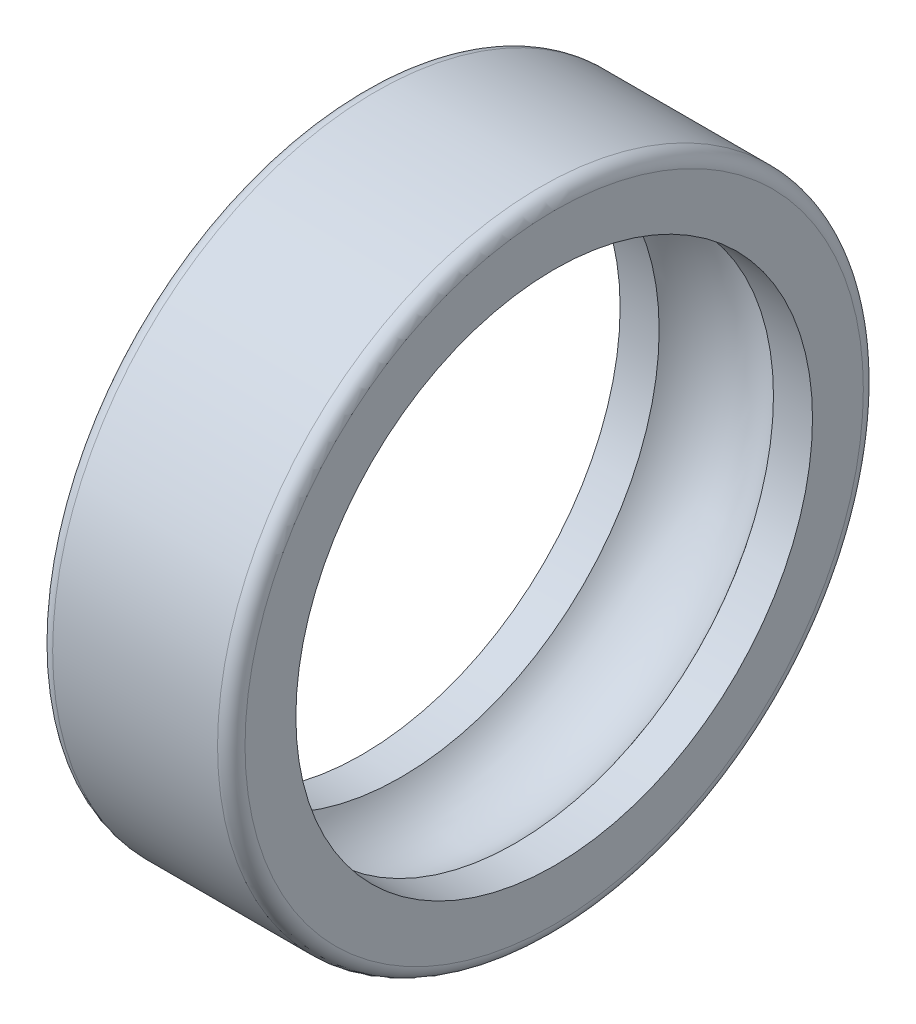
ISO-10303-21;
HEADER;
FILE_DESCRIPTION(('STEP AP214'),'2;1');
FILE_NAME('part.step','',(''),(''),'','','');
FILE_SCHEMA(('AUTOMOTIVE_DESIGN { 1 0 10303 214 1 1 1 1 }'));
ENDSEC;
DATA;
#1=APPLICATION_CONTEXT('core data for automotive mechanical design processes');
#2=APPLICATION_PROTOCOL_DEFINITION('international standard','automotive_design',2000,#1);
#3=PRODUCT_CONTEXT('',#1,'mechanical');
#4=PRODUCT('Part','Part','',(#3));
#5=PRODUCT_RELATED_PRODUCT_CATEGORY('part','',(#4));
#6=PRODUCT_DEFINITION_FORMATION('','',#4);
#7=PRODUCT_DEFINITION_CONTEXT('part definition',#1,'design');
#8=PRODUCT_DEFINITION('design','',#6,#7);
#9=PRODUCT_DEFINITION_SHAPE('','',#8);
#10=(LENGTH_UNIT() NAMED_UNIT(*) SI_UNIT(.MILLI.,.METRE.));
#11=(NAMED_UNIT(*) PLANE_ANGLE_UNIT() SI_UNIT($,.RADIAN.));
#12=(NAMED_UNIT(*) SI_UNIT($,.STERADIAN.) SOLID_ANGLE_UNIT());
#13=UNCERTAINTY_MEASURE_WITH_UNIT(LENGTH_MEASURE(1.E-05),#10,'distance_accuracy_value','');
#14=(GEOMETRIC_REPRESENTATION_CONTEXT(3) GLOBAL_UNCERTAINTY_ASSIGNED_CONTEXT((#13)) GLOBAL_UNIT_ASSIGNED_CONTEXT((#10,
#11,#12)) REPRESENTATION_CONTEXT('',''));
#15=CARTESIAN_POINT('',(0.,0.,0.));
#16=DIRECTION('',(0.,0.,1.));
#17=DIRECTION('',(1.,0.,0.));
#18=AXIS2_PLACEMENT_3D('',#15,#16,#17);
#19=CARTESIAN_POINT('',(0.,22.5,0.));
#20=DIRECTION('',(1.,0.,0.));
#21=DIRECTION('',(0.,0.,-1.));
#22=AXIS2_PLACEMENT_3D('',#19,#20,#21);
#23=PLANE('',#22);
#24=CARTESIAN_POINT('',(0.,0.,0.));
#25=DIRECTION('',(-1.,0.,0.));
#26=DIRECTION('',(0.,0.,1.));
#27=AXIS2_PLACEMENT_3D('',#24,#25,#26);
#28=CIRCLE('',#27,18.8);
#29=CARTESIAN_POINT('',(0.,0.,18.8));
#30=VERTEX_POINT('',#29);
#31=EDGE_CURVE('E10',#30,#30,#28,.T.);
#32=ORIENTED_EDGE('',*,*,#31,.F.);
#33=EDGE_LOOP('',(#32));
#34=FACE_BOUND('',#33,.T.);
#35=CARTESIAN_POINT('',(0.,0.,0.));
#36=DIRECTION('',(-1.,0.,0.));
#37=DIRECTION('',(0.,0.,1.));
#38=AXIS2_PLACEMENT_3D('',#35,#36,#37);
#39=CIRCLE('',#38,22.5);
#40=CARTESIAN_POINT('',(0.,0.,22.5));
#41=VERTEX_POINT('',#40);
#42=EDGE_CURVE('E43',#41,#41,#39,.T.);
#43=ORIENTED_EDGE('',*,*,#42,.T.);
#44=EDGE_LOOP('',(#43));
#45=FACE_BOUND('',#44,.T.);
#46=ADVANCED_FACE('F15',(#34,#45),#23,.F.);
#47=CARTESIAN_POINT('',(0.,0.,0.));
#48=DIRECTION('',(-1.,0.,0.));
#49=DIRECTION('',(0.,0.,1.));
#50=AXIS2_PLACEMENT_3D('',#47,#48,#49);
#51=CYLINDRICAL_SURFACE('',#50,18.8);
#52=CARTESIAN_POINT('',(2.84074826441101,0.,0.));
#53=DIRECTION('',(-1.,0.,0.));
#54=DIRECTION('',(0.,0.,1.));
#55=AXIS2_PLACEMENT_3D('',#52,#53,#54);
#56=CIRCLE('',#55,18.8);
#57=CARTESIAN_POINT('',(2.84074826441101,0.,18.8));
#58=VERTEX_POINT('',#57);
#59=EDGE_CURVE('E21',#58,#58,#56,.T.);
#60=ORIENTED_EDGE('',*,*,#59,.F.);
#61=EDGE_LOOP('',(#60));
#62=FACE_BOUND('',#61,.T.);
#63=ORIENTED_EDGE('',*,*,#31,.T.);
#64=EDGE_LOOP('',(#63));
#65=FACE_BOUND('',#64,.T.);
#66=ADVANCED_FACE('F80',(#62,#65),#51,.F.);
#67=CARTESIAN_POINT('',(7.,0.,0.));
#68=DIRECTION('',(-1.,0.,0.));
#69=DIRECTION('',(0.,0.,1.));
#70=AXIS2_PLACEMENT_3D('',#67,#68,#69);
#71=TOROIDAL_SURFACE('',#70,16.025,5.);
#72=ORIENTED_EDGE('',*,*,#59,.T.);
#73=EDGE_LOOP('',(#72));
#74=FACE_BOUND('',#73,.T.);
#75=CARTESIAN_POINT('',(11.159251735589,0.,0.));
#76=DIRECTION('',(-1.,0.,0.));
#77=DIRECTION('',(0.,0.,1.));
#78=AXIS2_PLACEMENT_3D('',#75,#76,#77);
#79=CIRCLE('',#78,18.8);
#80=CARTESIAN_POINT('',(11.159251735589,0.,18.8));
#81=VERTEX_POINT('',#80);
#82=EDGE_CURVE('E25',#81,#81,#79,.T.);
#83=ORIENTED_EDGE('',*,*,#82,.F.);
#84=EDGE_LOOP('',(#83));
#85=FACE_BOUND('',#84,.T.);
#86=ADVANCED_FACE('F75',(#74,#85),#71,.F.);
#87=CARTESIAN_POINT('',(0.,0.,0.));
#88=DIRECTION('',(-1.,0.,0.));
#89=DIRECTION('',(0.,0.,1.));
#90=AXIS2_PLACEMENT_3D('',#87,#88,#89);
#91=CYLINDRICAL_SURFACE('',#90,18.8);
#92=CARTESIAN_POINT('',(14.,0.,0.));
#93=DIRECTION('',(-1.,0.,0.));
#94=DIRECTION('',(0.,0.,1.));
#95=AXIS2_PLACEMENT_3D('',#92,#93,#94);
#96=CIRCLE('',#95,18.8);
#97=CARTESIAN_POINT('',(14.,0.,18.8));
#98=VERTEX_POINT('',#97);
#99=EDGE_CURVE('E29',#98,#98,#96,.T.);
#100=ORIENTED_EDGE('',*,*,#99,.F.);
#101=EDGE_LOOP('',(#100));
#102=FACE_BOUND('',#101,.T.);
#103=ORIENTED_EDGE('',*,*,#82,.T.);
#104=EDGE_LOOP('',(#103));
#105=FACE_BOUND('',#104,.T.);
#106=ADVANCED_FACE('F69',(#102,#105),#91,.F.);
#107=CARTESIAN_POINT('',(14.,18.8,0.));
#108=DIRECTION('',(-1.,0.,0.));
#109=DIRECTION('',(0.,0.,1.));
#110=AXIS2_PLACEMENT_3D('',#107,#108,#109);
#111=PLANE('',#110);
#112=CARTESIAN_POINT('',(14.,0.,0.));
#113=DIRECTION('',(-1.,0.,0.));
#114=DIRECTION('',(0.,0.,1.));
#115=AXIS2_PLACEMENT_3D('',#112,#113,#114);
#116=CIRCLE('',#115,22.5);
#117=CARTESIAN_POINT('',(14.,0.,22.5));
#118=VERTEX_POINT('',#117);
#119=EDGE_CURVE('E34',#118,#118,#116,.T.);
#120=ORIENTED_EDGE('',*,*,#119,.F.);
#121=EDGE_LOOP('',(#120));
#122=FACE_BOUND('',#121,.T.);
#123=ORIENTED_EDGE('',*,*,#99,.T.);
#124=EDGE_LOOP('',(#123));
#125=FACE_BOUND('',#124,.T.);
#126=ADVANCED_FACE('F63',(#122,#125),#111,.F.);
#127=CARTESIAN_POINT('',(13.,0.,0.));
#128=DIRECTION('',(-1.,0.,0.));
#129=DIRECTION('',(0.,0.,1.));
#130=AXIS2_PLACEMENT_3D('',#127,#128,#129);
#131=TOROIDAL_SURFACE('',#130,22.5,1.);
#132=CARTESIAN_POINT('',(13.,0.,0.));
#133=DIRECTION('',(-1.,0.,0.));
#134=DIRECTION('',(0.,0.,1.));
#135=AXIS2_PLACEMENT_3D('',#132,#133,#134);
#136=CIRCLE('',#135,23.5);
#137=CARTESIAN_POINT('',(13.,0.,23.5));
#138=VERTEX_POINT('',#137);
#139=EDGE_CURVE('E37',#138,#138,#136,.T.);
#140=ORIENTED_EDGE('',*,*,#139,.F.);
#141=EDGE_LOOP('',(#140));
#142=FACE_BOUND('',#141,.T.);
#143=ORIENTED_EDGE('',*,*,#119,.T.);
#144=EDGE_LOOP('',(#143));
#145=FACE_BOUND('',#144,.T.);
#146=ADVANCED_FACE('F57',(#142,#145),#131,.T.);
#147=CARTESIAN_POINT('',(0.,0.,0.));
#148=DIRECTION('',(-1.,0.,0.));
#149=DIRECTION('',(0.,0.,1.));
#150=AXIS2_PLACEMENT_3D('',#147,#148,#149);
#151=CYLINDRICAL_SURFACE('',#150,23.5);
#152=CARTESIAN_POINT('',(1.,0.,0.));
#153=DIRECTION('',(-1.,0.,0.));
#154=DIRECTION('',(0.,0.,1.));
#155=AXIS2_PLACEMENT_3D('',#152,#153,#154);
#156=CIRCLE('',#155,23.5);
#157=CARTESIAN_POINT('',(1.,0.,23.5));
#158=VERTEX_POINT('',#157);
#159=EDGE_CURVE('E40',#158,#158,#156,.T.);
#160=ORIENTED_EDGE('',*,*,#159,.F.);
#161=EDGE_LOOP('',(#160));
#162=FACE_BOUND('',#161,.T.);
#163=ORIENTED_EDGE('',*,*,#139,.T.);
#164=EDGE_LOOP('',(#163));
#165=FACE_BOUND('',#164,.T.);
#166=ADVANCED_FACE('F51',(#162,#165),#151,.T.);
#167=CARTESIAN_POINT('',(1.,0.,0.));
#168=DIRECTION('',(-1.,0.,0.));
#169=DIRECTION('',(0.,0.,1.));
#170=AXIS2_PLACEMENT_3D('',#167,#168,#169);
#171=TOROIDAL_SURFACE('',#170,22.5,1.);
#172=ORIENTED_EDGE('',*,*,#42,.F.);
#173=EDGE_LOOP('',(#172));
#174=FACE_BOUND('',#173,.T.);
#175=ORIENTED_EDGE('',*,*,#159,.T.);
#176=EDGE_LOOP('',(#175));
#177=FACE_BOUND('',#176,.T.);
#178=ADVANCED_FACE('F48',(#174,#177),#171,.T.);
#179=CLOSED_SHELL('',(#46,#66,#86,#106,#126,#146,#166,#178));
#180=MANIFOLD_SOLID_BREP('B1',#179);
#181=ADVANCED_BREP_SHAPE_REPRESENTATION('',(#18,#180),#14);
#182=SHAPE_DEFINITION_REPRESENTATION(#9,#181);
ENDSEC;
END-ISO-10303-21;
